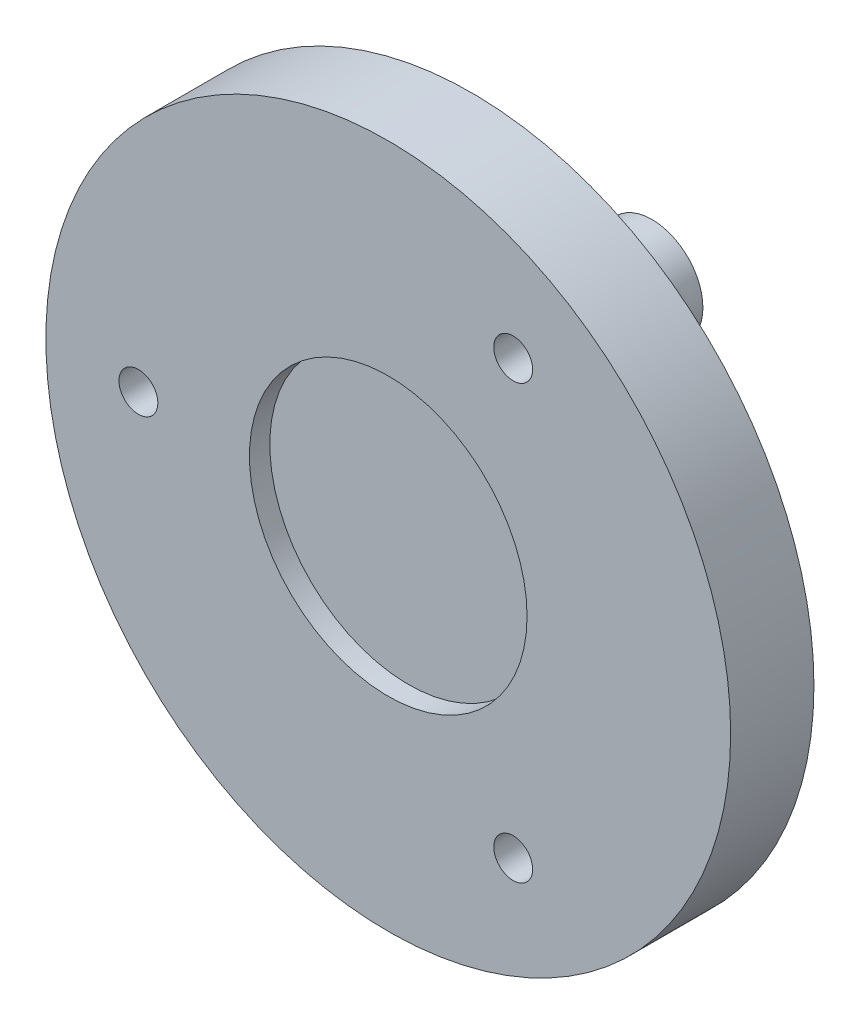
ISO-10303-21;
HEADER;
FILE_DESCRIPTION(('STEP AP214'),'2;1');
FILE_NAME('part.step','',(''),(''),'','','');
FILE_SCHEMA(('AUTOMOTIVE_DESIGN { 1 0 10303 214 1 1 1 1 }'));
ENDSEC;
DATA;
#1=APPLICATION_CONTEXT('core data for automotive mechanical design processes');
#2=APPLICATION_PROTOCOL_DEFINITION('international standard','automotive_design',2000,#1);
#3=PRODUCT_CONTEXT('',#1,'mechanical');
#4=PRODUCT('Part','Part','',(#3));
#5=PRODUCT_RELATED_PRODUCT_CATEGORY('part','',(#4));
#6=PRODUCT_DEFINITION_FORMATION('','',#4);
#7=PRODUCT_DEFINITION_CONTEXT('part definition',#1,'design');
#8=PRODUCT_DEFINITION('design','',#6,#7);
#9=PRODUCT_DEFINITION_SHAPE('','',#8);
#10=(LENGTH_UNIT() NAMED_UNIT(*) SI_UNIT(.MILLI.,.METRE.));
#11=(NAMED_UNIT(*) PLANE_ANGLE_UNIT() SI_UNIT($,.RADIAN.));
#12=(NAMED_UNIT(*) SI_UNIT($,.STERADIAN.) SOLID_ANGLE_UNIT());
#13=UNCERTAINTY_MEASURE_WITH_UNIT(LENGTH_MEASURE(1.E-05),#10,'distance_accuracy_value','');
#14=(GEOMETRIC_REPRESENTATION_CONTEXT(3) GLOBAL_UNCERTAINTY_ASSIGNED_CONTEXT((#13)) GLOBAL_UNIT_ASSIGNED_CONTEXT((#10,
#11,#12)) REPRESENTATION_CONTEXT('',''));
#15=CARTESIAN_POINT('',(0.,0.,0.));
#16=DIRECTION('',(0.,0.,1.));
#17=DIRECTION('',(1.,0.,0.));
#18=AXIS2_PLACEMENT_3D('',#15,#16,#17);
#19=CARTESIAN_POINT('',(0.,0.,10.123));
#20=DIRECTION('',(0.,0.,1.));
#21=DIRECTION('',(1.,0.,0.));
#22=AXIS2_PLACEMENT_3D('',#19,#20,#21);
#23=CYLINDRICAL_SURFACE('',#22,1.4);
#24=CARTESIAN_POINT('',(0.,0.,-2.3));
#25=DIRECTION('',(0.,0.,1.));
#26=DIRECTION('',(1.,0.,0.));
#27=AXIS2_PLACEMENT_3D('',#24,#25,#26);
#28=CIRCLE('',#27,1.4);
#29=CARTESIAN_POINT('',(1.4,0.,-2.3));
#30=VERTEX_POINT('',#29);
#31=EDGE_CURVE('E88',#30,#30,#28,.T.);
#32=ORIENTED_EDGE('',*,*,#31,.T.);
#33=EDGE_LOOP('',(#32));
#34=FACE_BOUND('',#33,.T.);
#35=CARTESIAN_POINT('',(0.,0.,-10.));
#36=DIRECTION('',(0.,0.,1.));
#37=DIRECTION('',(1.,0.,0.));
#38=AXIS2_PLACEMENT_3D('',#35,#36,#37);
#39=CIRCLE('',#38,1.4);
#40=CARTESIAN_POINT('',(1.4,0.,-10.));
#41=VERTEX_POINT('',#40);
#42=EDGE_CURVE('E10',#41,#41,#39,.T.);
#43=ORIENTED_EDGE('',*,*,#42,.F.);
#44=EDGE_LOOP('',(#43));
#45=FACE_BOUND('',#44,.T.);
#46=ADVANCED_FACE('F37',(#34,#45),#23,.F.);
#47=CARTESIAN_POINT('',(1.4,0.,-10.));
#48=DIRECTION('',(0.,0.,-1.));
#49=DIRECTION('',(-1.,0.,0.));
#50=AXIS2_PLACEMENT_3D('',#47,#48,#49);
#51=PLANE('',#50);
#52=ORIENTED_EDGE('',*,*,#42,.T.);
#53=EDGE_LOOP('',(#52));
#54=FACE_BOUND('',#53,.T.);
#55=CARTESIAN_POINT('',(0.,0.,-10.));
#56=DIRECTION('',(0.,0.,1.));
#57=DIRECTION('',(1.,0.,0.));
#58=AXIS2_PLACEMENT_3D('',#55,#56,#57);
#59=CIRCLE('',#58,3.45);
#60=CARTESIAN_POINT('',(3.45,0.,-10.));
#61=VERTEX_POINT('',#60);
#62=EDGE_CURVE('E44',#61,#61,#59,.T.);
#63=ORIENTED_EDGE('',*,*,#62,.F.);
#64=EDGE_LOOP('',(#63));
#65=FACE_BOUND('',#64,.T.);
#66=ADVANCED_FACE('F118',(#54,#65),#51,.T.);
#67=CARTESIAN_POINT('',(0.,0.,10.123));
#68=DIRECTION('',(0.,0.,1.));
#69=DIRECTION('',(1.,0.,0.));
#70=AXIS2_PLACEMENT_3D('',#67,#68,#69);
#71=CYLINDRICAL_SURFACE('',#70,3.45);
#72=ORIENTED_EDGE('',*,*,#62,.T.);
#73=EDGE_LOOP('',(#72));
#74=FACE_BOUND('',#73,.T.);
#75=CARTESIAN_POINT('',(0.,0.,-4.7));
#76=DIRECTION('',(0.,0.,1.));
#77=DIRECTION('',(1.,0.,0.));
#78=AXIS2_PLACEMENT_3D('',#75,#76,#77);
#79=CIRCLE('',#78,3.45);
#80=CARTESIAN_POINT('',(3.45,0.,-4.7));
#81=VERTEX_POINT('',#80);
#82=EDGE_CURVE('E49',#81,#81,#79,.T.);
#83=ORIENTED_EDGE('',*,*,#82,.F.);
#84=EDGE_LOOP('',(#83));
#85=FACE_BOUND('',#84,.T.);
#86=ADVANCED_FACE('F116',(#74,#85),#71,.T.);
#87=CARTESIAN_POINT('',(3.45,0.,-4.7));
#88=DIRECTION('',(0.,0.,-1.));
#89=DIRECTION('',(-1.,0.,0.));
#90=AXIS2_PLACEMENT_3D('',#87,#88,#89);
#91=PLANE('',#90);
#92=ORIENTED_EDGE('',*,*,#82,.T.);
#93=EDGE_LOOP('',(#92));
#94=FACE_BOUND('',#93,.T.);
#95=CARTESIAN_POINT('',(0.,0.,-4.7));
#96=DIRECTION('',(0.,0.,1.));
#97=DIRECTION('',(1.,0.,0.));
#98=AXIS2_PLACEMENT_3D('',#95,#96,#97);
#99=CIRCLE('',#98,4.5);
#100=CARTESIAN_POINT('',(4.5,0.,-4.7));
#101=VERTEX_POINT('',#100);
#102=EDGE_CURVE('E108',#101,#101,#99,.T.);
#103=ORIENTED_EDGE('',*,*,#102,.F.);
#104=EDGE_LOOP('',(#103));
#105=FACE_BOUND('',#104,.T.);
#106=ADVANCED_FACE('F113',(#94,#105),#91,.T.);
#107=CARTESIAN_POINT('',(0.,0.,10.123));
#108=DIRECTION('',(0.,0.,1.));
#109=DIRECTION('',(1.,0.,0.));
#110=AXIS2_PLACEMENT_3D('',#107,#108,#109);
#111=CYLINDRICAL_SURFACE('',#110,4.5);
#112=ORIENTED_EDGE('',*,*,#102,.T.);
#113=EDGE_LOOP('',(#112));
#114=FACE_BOUND('',#113,.T.);
#115=CARTESIAN_POINT('',(0.,0.,-4.5));
#116=DIRECTION('',(0.,0.,1.));
#117=DIRECTION('',(1.,0.,0.));
#118=AXIS2_PLACEMENT_3D('',#115,#116,#117);
#119=CIRCLE('',#118,4.5);
#120=CARTESIAN_POINT('',(4.5,0.,-4.5));
#121=VERTEX_POINT('',#120);
#122=EDGE_CURVE('E105',#121,#121,#119,.T.);
#123=ORIENTED_EDGE('',*,*,#122,.F.);
#124=EDGE_LOOP('',(#123));
#125=FACE_BOUND('',#124,.T.);
#126=ADVANCED_FACE('F125',(#114,#125),#111,.T.);
#127=CARTESIAN_POINT('',(4.5,0.,-4.5));
#128=DIRECTION('',(0.,0.,-1.));
#129=DIRECTION('',(-1.,0.,0.));
#130=AXIS2_PLACEMENT_3D('',#127,#128,#129);
#131=PLANE('',#130);
#132=CARTESIAN_POINT('',(6.74999999999985,11.69134295109,-4.5));
#133=DIRECTION('',(0.,0.,1.));
#134=DIRECTION('',(-0.499999999999992,-0.866025403784443,0.));
#135=AXIS2_PLACEMENT_3D('',#132,#133,#134);
#136=CIRCLE('',#135,2.75);
#137=CARTESIAN_POINT('',(5.37499999999987,9.30977309068279,-4.5));
#138=VERTEX_POINT('',#137);
#139=EDGE_CURVE('E73',#138,#138,#136,.T.);
#140=ORIENTED_EDGE('',*,*,#139,.T.);
#141=EDGE_LOOP('',(#140));
#142=FACE_BOUND('',#141,.T.);
#143=CARTESIAN_POINT('',(6.7500000000001,-11.6913429510899,-4.5));
#144=DIRECTION('',(0.,0.,1.));
#145=DIRECTION('',(-0.500000000000004,0.866025403784436,0.));
#146=AXIS2_PLACEMENT_3D('',#143,#144,#145);
#147=CIRCLE('',#146,2.75);
#148=CARTESIAN_POINT('',(5.37500000000009,-9.30977309068267,-4.5));
#149=VERTEX_POINT('',#148);
#150=EDGE_CURVE('E79',#149,#149,#147,.T.);
#151=ORIENTED_EDGE('',*,*,#150,.T.);
#152=EDGE_LOOP('',(#151));
#153=FACE_BOUND('',#152,.T.);
#154=CARTESIAN_POINT('',(-13.5,0.,-4.5));
#155=DIRECTION('',(0.,0.,1.));
#156=DIRECTION('',(1.,0.,0.));
#157=AXIS2_PLACEMENT_3D('',#154,#155,#156);
#158=CIRCLE('',#157,2.75);
#159=CARTESIAN_POINT('',(-10.75,0.,-4.5));
#160=VERTEX_POINT('',#159);
#161=EDGE_CURVE('E85',#160,#160,#158,.T.);
#162=ORIENTED_EDGE('',*,*,#161,.T.);
#163=EDGE_LOOP('',(#162));
#164=FACE_BOUND('',#163,.T.);
#165=ORIENTED_EDGE('',*,*,#122,.T.);
#166=EDGE_LOOP('',(#165));
#167=FACE_BOUND('',#166,.T.);
#168=CARTESIAN_POINT('',(0.,0.,-4.5));
#169=DIRECTION('',(0.,0.,1.));
#170=DIRECTION('',(1.,0.,0.));
#171=AXIS2_PLACEMENT_3D('',#168,#169,#170);
#172=CIRCLE('',#171,18.5);
#173=CARTESIAN_POINT('',(18.5,0.,-4.5));
#174=VERTEX_POINT('',#173);
#175=EDGE_CURVE('E102',#174,#174,#172,.T.);
#176=ORIENTED_EDGE('',*,*,#175,.F.);
#177=EDGE_LOOP('',(#176));
#178=FACE_BOUND('',#177,.T.);
#179=ADVANCED_FACE('F161',(#142,#153,#164,#167,#178),#131,.T.);
#180=CARTESIAN_POINT('',(0.,0.,10.123));
#181=DIRECTION('',(0.,0.,1.));
#182=DIRECTION('',(1.,0.,0.));
#183=AXIS2_PLACEMENT_3D('',#180,#181,#182);
#184=CYLINDRICAL_SURFACE('',#183,18.5);
#185=ORIENTED_EDGE('',*,*,#175,.T.);
#186=EDGE_LOOP('',(#185));
#187=FACE_BOUND('',#186,.T.);
#188=CARTESIAN_POINT('',(0.,0.,0.));
#189=DIRECTION('',(0.,0.,1.));
#190=DIRECTION('',(1.,0.,0.));
#191=AXIS2_PLACEMENT_3D('',#188,#189,#190);
#192=CIRCLE('',#191,18.5);
#193=CARTESIAN_POINT('',(18.5,0.,0.));
#194=VERTEX_POINT('',#193);
#195=EDGE_CURVE('E99',#194,#194,#192,.T.);
#196=ORIENTED_EDGE('',*,*,#195,.F.);
#197=EDGE_LOOP('',(#196));
#198=FACE_BOUND('',#197,.T.);
#199=ADVANCED_FACE('F157',(#187,#198),#184,.T.);
#200=CARTESIAN_POINT('',(18.5,0.,0.));
#201=DIRECTION('',(0.,0.,1.));
#202=DIRECTION('',(1.,0.,0.));
#203=AXIS2_PLACEMENT_3D('',#200,#201,#202);
#204=PLANE('',#203);
#205=CARTESIAN_POINT('',(6.7500000000001,-11.6913429510899,0.));
#206=DIRECTION('',(0.,0.,1.));
#207=DIRECTION('',(-0.500000000000004,0.866025403784436,0.));
#208=AXIS2_PLACEMENT_3D('',#205,#206,#207);
#209=CIRCLE('',#208,1.05);
#210=CARTESIAN_POINT('',(6.22500000000009,-10.7820162771162,0.));
#211=VERTEX_POINT('',#210);
#212=EDGE_CURVE('E59',#211,#211,#209,.T.);
#213=ORIENTED_EDGE('',*,*,#212,.F.);
#214=EDGE_LOOP('',(#213));
#215=FACE_BOUND('',#214,.T.);
#216=CARTESIAN_POINT('',(6.74999999999985,11.69134295109,0.));
#217=DIRECTION('',(0.,0.,1.));
#218=DIRECTION('',(-0.499999999999992,-0.866025403784443,0.));
#219=AXIS2_PLACEMENT_3D('',#216,#217,#218);
#220=CIRCLE('',#219,1.05);
#221=CARTESIAN_POINT('',(6.22499999999986,10.7820162771163,0.));
#222=VERTEX_POINT('',#221);
#223=EDGE_CURVE('E64',#222,#222,#220,.T.);
#224=ORIENTED_EDGE('',*,*,#223,.F.);
#225=EDGE_LOOP('',(#224));
#226=FACE_BOUND('',#225,.T.);
#227=CARTESIAN_POINT('',(-13.5,0.,0.));
#228=DIRECTION('',(0.,0.,1.));
#229=DIRECTION('',(1.,0.,0.));
#230=AXIS2_PLACEMENT_3D('',#227,#228,#229);
#231=CIRCLE('',#230,1.05);
#232=CARTESIAN_POINT('',(-12.45,0.,0.));
#233=VERTEX_POINT('',#232);
#234=EDGE_CURVE('E56',#233,#233,#231,.T.);
#235=ORIENTED_EDGE('',*,*,#234,.F.);
#236=EDGE_LOOP('',(#235));
#237=FACE_BOUND('',#236,.T.);
#238=ORIENTED_EDGE('',*,*,#195,.T.);
#239=EDGE_LOOP('',(#238));
#240=FACE_BOUND('',#239,.T.);
#241=CARTESIAN_POINT('',(0.,0.,0.));
#242=DIRECTION('',(0.,0.,1.));
#243=DIRECTION('',(1.,0.,0.));
#244=AXIS2_PLACEMENT_3D('',#241,#242,#243);
#245=CIRCLE('',#244,7.5);
#246=CARTESIAN_POINT('',(7.5,0.,0.));
#247=VERTEX_POINT('',#246);
#248=EDGE_CURVE('E96',#247,#247,#245,.T.);
#249=ORIENTED_EDGE('',*,*,#248,.F.);
#250=EDGE_LOOP('',(#249));
#251=FACE_BOUND('',#250,.T.);
#252=ADVANCED_FACE('F153',(#215,#226,#237,#240,#251),#204,.T.);
#253=CARTESIAN_POINT('',(0.,0.,10.123));
#254=DIRECTION('',(0.,0.,1.));
#255=DIRECTION('',(1.,0.,0.));
#256=AXIS2_PLACEMENT_3D('',#253,#254,#255);
#257=CYLINDRICAL_SURFACE('',#256,7.5);
#258=ORIENTED_EDGE('',*,*,#248,.T.);
#259=EDGE_LOOP('',(#258));
#260=FACE_BOUND('',#259,.T.);
#261=CARTESIAN_POINT('',(0.,0.,-1.1));
#262=DIRECTION('',(0.,0.,1.));
#263=DIRECTION('',(1.,0.,0.));
#264=AXIS2_PLACEMENT_3D('',#261,#262,#263);
#265=CIRCLE('',#264,7.5);
#266=CARTESIAN_POINT('',(7.5,0.,-1.1));
#267=VERTEX_POINT('',#266);
#268=EDGE_CURVE('E93',#267,#267,#265,.T.);
#269=ORIENTED_EDGE('',*,*,#268,.F.);
#270=EDGE_LOOP('',(#269));
#271=FACE_BOUND('',#270,.T.);
#272=ADVANCED_FACE('F146',(#260,#271),#257,.F.);
#273=CARTESIAN_POINT('',(7.5,0.,-1.1));
#274=DIRECTION('',(0.,0.,1.));
#275=DIRECTION('',(1.,0.,0.));
#276=AXIS2_PLACEMENT_3D('',#273,#274,#275);
#277=PLANE('',#276);
#278=ORIENTED_EDGE('',*,*,#268,.T.);
#279=EDGE_LOOP('',(#278));
#280=FACE_BOUND('',#279,.T.);
#281=ADVANCED_FACE('F137',(#280),#277,.T.);
#282=CARTESIAN_POINT('',(0.,0.,-2.3));
#283=DIRECTION('',(0.,0.,-1.));
#284=DIRECTION('',(-1.,0.,0.));
#285=AXIS2_PLACEMENT_3D('',#282,#283,#284);
#286=PLANE('',#285);
#287=ORIENTED_EDGE('',*,*,#31,.F.);
#288=EDGE_LOOP('',(#287));
#289=FACE_BOUND('',#288,.T.);
#290=ADVANCED_FACE('F134',(#289),#286,.T.);
#291=CARTESIAN_POINT('',(-13.5,0.,-4.5));
#292=DIRECTION('',(0.,0.,-1.));
#293=DIRECTION('',(-1.,0.,0.));
#294=AXIS2_PLACEMENT_3D('',#291,#292,#293);
#295=CYLINDRICAL_SURFACE('',#294,2.75);
#296=ORIENTED_EDGE('',*,*,#161,.F.);
#297=EDGE_LOOP('',(#296));
#298=FACE_BOUND('',#297,.T.);
#299=CARTESIAN_POINT('',(-13.5,0.,-7.5));
#300=DIRECTION('',(0.,0.,1.));
#301=DIRECTION('',(1.,0.,0.));
#302=AXIS2_PLACEMENT_3D('',#299,#300,#301);
#303=CIRCLE('',#302,2.75);
#304=CARTESIAN_POINT('',(-10.75,0.,-7.5));
#305=VERTEX_POINT('',#304);
#306=EDGE_CURVE('E82',#305,#305,#303,.T.);
#307=ORIENTED_EDGE('',*,*,#306,.T.);
#308=EDGE_LOOP('',(#307));
#309=FACE_BOUND('',#308,.T.);
#310=ADVANCED_FACE('F136',(#298,#309),#295,.T.);
#311=CARTESIAN_POINT('',(-13.5,0.,-7.5));
#312=DIRECTION('',(0.,0.,1.));
#313=DIRECTION('',(1.,0.,0.));
#314=AXIS2_PLACEMENT_3D('',#311,#312,#313);
#315=PLANE('',#314);
#316=CARTESIAN_POINT('',(-13.5,0.,-7.5));
#317=DIRECTION('',(0.,0.,1.));
#318=DIRECTION('',(1.,0.,0.));
#319=AXIS2_PLACEMENT_3D('',#316,#317,#318);
#320=CIRCLE('',#319,1.05);
#321=CARTESIAN_POINT('',(-12.45,0.,-7.5));
#322=VERTEX_POINT('',#321);
#323=EDGE_CURVE('E53',#322,#322,#320,.T.);
#324=ORIENTED_EDGE('',*,*,#323,.T.);
#325=EDGE_LOOP('',(#324));
#326=FACE_BOUND('',#325,.T.);
#327=ORIENTED_EDGE('',*,*,#306,.F.);
#328=EDGE_LOOP('',(#327));
#329=FACE_BOUND('',#328,.T.);
#330=ADVANCED_FACE('F143',(#326,#329),#315,.F.);
#331=CARTESIAN_POINT('',(6.7500000000001,-11.6913429510899,-4.5));
#332=DIRECTION('',(0.,0.,-1.));
#333=DIRECTION('',(-1.,0.,0.));
#334=AXIS2_PLACEMENT_3D('',#331,#332,#333);
#335=CYLINDRICAL_SURFACE('',#334,2.75);
#336=ORIENTED_EDGE('',*,*,#150,.F.);
#337=EDGE_LOOP('',(#336));
#338=FACE_BOUND('',#337,.T.);
#339=CARTESIAN_POINT('',(6.7500000000001,-11.6913429510899,-7.5));
#340=DIRECTION('',(0.,0.,1.));
#341=DIRECTION('',(-0.500000000000004,0.866025403784436,0.));
#342=AXIS2_PLACEMENT_3D('',#339,#340,#341);
#343=CIRCLE('',#342,2.75);
#344=CARTESIAN_POINT('',(5.37500000000009,-9.30977309068267,-7.5));
#345=VERTEX_POINT('',#344);
#346=EDGE_CURVE('E76',#345,#345,#343,.T.);
#347=ORIENTED_EDGE('',*,*,#346,.T.);
#348=EDGE_LOOP('',(#347));
#349=FACE_BOUND('',#348,.T.);
#350=ADVANCED_FACE('F230',(#338,#349),#335,.T.);
#351=CARTESIAN_POINT('',(6.7500000000001,-11.6913429510899,-7.5));
#352=DIRECTION('',(0.,0.,1.));
#353=DIRECTION('',(-0.500000000000004,0.866025403784436,0.));
#354=AXIS2_PLACEMENT_3D('',#351,#352,#353);
#355=PLANE('',#354);
#356=CARTESIAN_POINT('',(6.7500000000001,-11.6913429510899,-7.5));
#357=DIRECTION('',(0.,0.,1.));
#358=DIRECTION('',(1.,0.,0.));
#359=AXIS2_PLACEMENT_3D('',#356,#357,#358);
#360=CIRCLE('',#359,1.05);
#361=CARTESIAN_POINT('',(7.8000000000001,-11.6913429510899,-7.5));
#362=VERTEX_POINT('',#361);
#363=EDGE_CURVE('E40',#362,#362,#360,.T.);
#364=ORIENTED_EDGE('',*,*,#363,.T.);
#365=EDGE_LOOP('',(#364));
#366=FACE_BOUND('',#365,.T.);
#367=ORIENTED_EDGE('',*,*,#346,.F.);
#368=EDGE_LOOP('',(#367));
#369=FACE_BOUND('',#368,.T.);
#370=ADVANCED_FACE('F236',(#366,#369),#355,.F.);
#371=CARTESIAN_POINT('',(6.74999999999985,11.69134295109,-4.5));
#372=DIRECTION('',(0.,0.,-1.));
#373=DIRECTION('',(-1.,0.,0.));
#374=AXIS2_PLACEMENT_3D('',#371,#372,#373);
#375=CYLINDRICAL_SURFACE('',#374,2.75);
#376=ORIENTED_EDGE('',*,*,#139,.F.);
#377=EDGE_LOOP('',(#376));
#378=FACE_BOUND('',#377,.T.);
#379=CARTESIAN_POINT('',(6.74999999999985,11.69134295109,-7.5));
#380=DIRECTION('',(0.,0.,1.));
#381=DIRECTION('',(-0.499999999999992,-0.866025403784443,0.));
#382=AXIS2_PLACEMENT_3D('',#379,#380,#381);
#383=CIRCLE('',#382,2.75);
#384=CARTESIAN_POINT('',(5.37499999999987,9.30977309068279,-7.5));
#385=VERTEX_POINT('',#384);
#386=EDGE_CURVE('E55',#385,#385,#383,.T.);
#387=ORIENTED_EDGE('',*,*,#386,.T.);
#388=EDGE_LOOP('',(#387));
#389=FACE_BOUND('',#388,.T.);
#390=ADVANCED_FACE('F243',(#378,#389),#375,.T.);
#391=CARTESIAN_POINT('',(6.74999999999985,11.69134295109,-7.5));
#392=DIRECTION('',(0.,0.,1.));
#393=DIRECTION('',(-0.499999999999992,-0.866025403784443,0.));
#394=AXIS2_PLACEMENT_3D('',#391,#392,#393);
#395=PLANE('',#394);
#396=CARTESIAN_POINT('',(6.74999999999985,11.69134295109,-7.5));
#397=DIRECTION('',(0.,0.,1.));
#398=DIRECTION('',(1.,0.,0.));
#399=AXIS2_PLACEMENT_3D('',#396,#397,#398);
#400=CIRCLE('',#399,1.05);
#401=CARTESIAN_POINT('',(7.79999999999985,11.69134295109,-7.5));
#402=VERTEX_POINT('',#401);
#403=EDGE_CURVE('E57',#402,#402,#400,.T.);
#404=ORIENTED_EDGE('',*,*,#403,.T.);
#405=EDGE_LOOP('',(#404));
#406=FACE_BOUND('',#405,.T.);
#407=ORIENTED_EDGE('',*,*,#386,.F.);
#408=EDGE_LOOP('',(#407));
#409=FACE_BOUND('',#408,.T.);
#410=ADVANCED_FACE('F251',(#406,#409),#395,.F.);
#411=CARTESIAN_POINT('',(-13.5,0.,-10.));
#412=DIRECTION('',(0.,0.,1.));
#413=DIRECTION('',(1.,0.,0.));
#414=AXIS2_PLACEMENT_3D('',#411,#412,#413);
#415=CYLINDRICAL_SURFACE('',#414,1.05);
#416=ORIENTED_EDGE('',*,*,#234,.T.);
#417=EDGE_LOOP('',(#416));
#418=FACE_BOUND('',#417,.T.);
#419=ORIENTED_EDGE('',*,*,#323,.F.);
#420=EDGE_LOOP('',(#419));
#421=FACE_BOUND('',#420,.T.);
#422=ADVANCED_FACE('F258',(#418,#421),#415,.F.);
#423=CARTESIAN_POINT('',(6.74999999999985,11.69134295109,-10.));
#424=DIRECTION('',(0.,0.,1.));
#425=DIRECTION('',(1.,0.,0.));
#426=AXIS2_PLACEMENT_3D('',#423,#424,#425);
#427=CYLINDRICAL_SURFACE('',#426,1.05);
#428=ORIENTED_EDGE('',*,*,#223,.T.);
#429=EDGE_LOOP('',(#428));
#430=FACE_BOUND('',#429,.T.);
#431=ORIENTED_EDGE('',*,*,#403,.F.);
#432=EDGE_LOOP('',(#431));
#433=FACE_BOUND('',#432,.T.);
#434=ADVANCED_FACE('F265',(#430,#433),#427,.F.);
#435=CARTESIAN_POINT('',(6.7500000000001,-11.6913429510899,-10.));
#436=DIRECTION('',(0.,0.,1.));
#437=DIRECTION('',(1.,0.,0.));
#438=AXIS2_PLACEMENT_3D('',#435,#436,#437);
#439=CYLINDRICAL_SURFACE('',#438,1.05);
#440=ORIENTED_EDGE('',*,*,#212,.T.);
#441=EDGE_LOOP('',(#440));
#442=FACE_BOUND('',#441,.T.);
#443=ORIENTED_EDGE('',*,*,#363,.F.);
#444=EDGE_LOOP('',(#443));
#445=FACE_BOUND('',#444,.T.);
#446=ADVANCED_FACE('F272',(#442,#445),#439,.F.);
#447=CLOSED_SHELL('',(#46,#66,#86,#106,#126,#179,#199,#252,#272,#281,#290,#310,#330,#350,#370,
#390,#410,#422,#434,#446));
#448=MANIFOLD_SOLID_BREP('B2',#447);
#449=ADVANCED_BREP_SHAPE_REPRESENTATION('',(#18,#448),#14);
#450=SHAPE_DEFINITION_REPRESENTATION(#9,#449);
ENDSEC;
END-ISO-10303-21;
